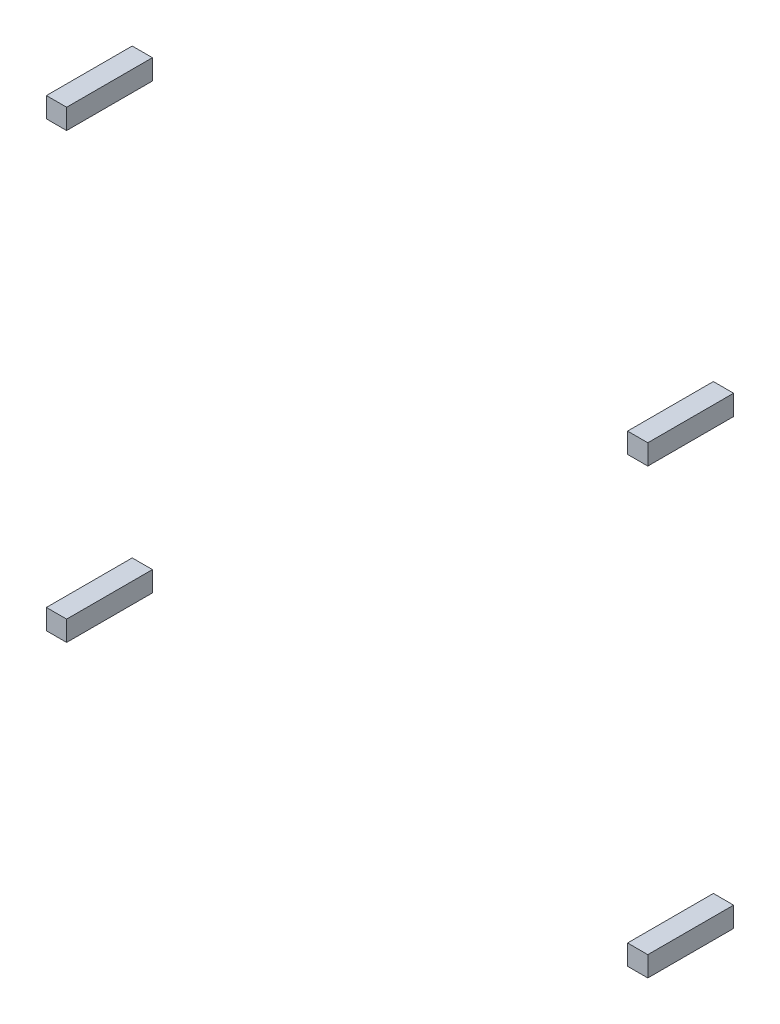
ISO-10303-21;
HEADER;
FILE_DESCRIPTION(('STEP AP214'),'2;1');
FILE_NAME('part.step','',(''),(''),'','','');
FILE_SCHEMA(('AUTOMOTIVE_DESIGN { 1 0 10303 214 1 1 1 1 }'));
ENDSEC;
DATA;
#1=APPLICATION_CONTEXT('core data for automotive mechanical design processes');
#2=APPLICATION_PROTOCOL_DEFINITION('international standard','automotive_design',2000,#1);
#3=PRODUCT_CONTEXT('',#1,'mechanical');
#4=PRODUCT('Part','Part','',(#3));
#5=PRODUCT_RELATED_PRODUCT_CATEGORY('part','',(#4));
#6=PRODUCT_DEFINITION_FORMATION('','',#4);
#7=PRODUCT_DEFINITION_CONTEXT('part definition',#1,'design');
#8=PRODUCT_DEFINITION('design','',#6,#7);
#9=PRODUCT_DEFINITION_SHAPE('','',#8);
#10=(LENGTH_UNIT() NAMED_UNIT(*) SI_UNIT(.MILLI.,.METRE.));
#11=(NAMED_UNIT(*) PLANE_ANGLE_UNIT() SI_UNIT($,.RADIAN.));
#12=(NAMED_UNIT(*) SI_UNIT($,.STERADIAN.) SOLID_ANGLE_UNIT());
#13=UNCERTAINTY_MEASURE_WITH_UNIT(LENGTH_MEASURE(1.E-05),#10,'distance_accuracy_value','');
#14=(GEOMETRIC_REPRESENTATION_CONTEXT(3) GLOBAL_UNCERTAINTY_ASSIGNED_CONTEXT((#13)) GLOBAL_UNIT_ASSIGNED_CONTEXT((#10,
#11,#12)) REPRESENTATION_CONTEXT('',''));
#15=CARTESIAN_POINT('',(0.,0.,0.));
#16=DIRECTION('',(0.,0.,1.));
#17=DIRECTION('',(1.,0.,0.));
#18=AXIS2_PLACEMENT_3D('',#15,#16,#17);
#19=CARTESIAN_POINT('',(20.6735533905932,15.8535533905933,3.));
#20=DIRECTION('',(-1.,0.,0.));
#21=DIRECTION('',(0.,0.,1.));
#22=AXIS2_PLACEMENT_3D('',#19,#20,#21);
#23=PLANE('',#22);
#24=DIRECTION('',(0.,1.,0.));
#25=VECTOR('',#24,1.);
#26=CARTESIAN_POINT('',(20.6735533905932,15.8535533905933,0.));
#27=LINE('',#26,#25);
#28=CARTESIAN_POINT('',(20.6735533905932,15.1464466094067,0.));
#29=VERTEX_POINT('',#28);
#30=CARTESIAN_POINT('',(20.6735533905932,15.8535533905933,0.));
#31=VERTEX_POINT('',#30);
#32=EDGE_CURVE('E108',#29,#31,#27,.T.);
#33=ORIENTED_EDGE('',*,*,#32,.T.);
#34=DIRECTION('',(0.,0.,-1.));
#35=VECTOR('',#34,1.);
#36=CARTESIAN_POINT('',(20.6735533905932,15.8535533905933,3.));
#37=LINE('',#36,#35);
#38=CARTESIAN_POINT('',(20.6735533905932,15.8535533905933,3.));
#39=VERTEX_POINT('',#38);
#40=EDGE_CURVE('E12',#39,#31,#37,.T.);
#41=ORIENTED_EDGE('',*,*,#40,.F.);
#42=DIRECTION('',(0.,1.,0.));
#43=VECTOR('',#42,1.);
#44=CARTESIAN_POINT('',(20.6735533905932,15.8535533905933,3.));
#45=LINE('',#44,#43);
#46=CARTESIAN_POINT('',(20.6735533905932,15.1464466094067,3.));
#47=VERTEX_POINT('',#46);
#48=EDGE_CURVE('E96',#47,#39,#45,.T.);
#49=ORIENTED_EDGE('',*,*,#48,.F.);
#50=DIRECTION('',(0.,0.,-1.));
#51=VECTOR('',#50,1.);
#52=CARTESIAN_POINT('',(20.6735533905932,15.1464466094067,3.));
#53=LINE('',#52,#51);
#54=EDGE_CURVE('E104',#47,#29,#53,.T.);
#55=ORIENTED_EDGE('',*,*,#54,.T.);
#56=EDGE_LOOP('',(#33,#41,#49,#55));
#57=FACE_BOUND('',#56,.T.);
#58=ADVANCED_FACE('F45',(#57),#23,.F.);
#59=CARTESIAN_POINT('',(19.9664466094067,15.8535533905933,3.));
#60=DIRECTION('',(0.,-1.,0.));
#61=DIRECTION('',(0.,0.,-1.));
#62=AXIS2_PLACEMENT_3D('',#59,#60,#61);
#63=PLANE('',#62);
#64=DIRECTION('',(-1.,0.,0.));
#65=VECTOR('',#64,1.);
#66=CARTESIAN_POINT('',(19.9664466094067,15.8535533905933,0.));
#67=LINE('',#66,#65);
#68=CARTESIAN_POINT('',(19.9664466094067,15.8535533905933,0.));
#69=VERTEX_POINT('',#68);
#70=EDGE_CURVE('E100',#31,#69,#67,.T.);
#71=ORIENTED_EDGE('',*,*,#70,.T.);
#72=DIRECTION('',(0.,0.,-1.));
#73=VECTOR('',#72,1.);
#74=CARTESIAN_POINT('',(19.9664466094067,15.8535533905933,3.));
#75=LINE('',#74,#73);
#76=CARTESIAN_POINT('',(19.9664466094067,15.8535533905933,3.));
#77=VERTEX_POINT('',#76);
#78=EDGE_CURVE('E53',#77,#69,#75,.T.);
#79=ORIENTED_EDGE('',*,*,#78,.F.);
#80=DIRECTION('',(-1.,0.,0.));
#81=VECTOR('',#80,1.);
#82=CARTESIAN_POINT('',(19.9664466094067,15.8535533905933,3.));
#83=LINE('',#82,#81);
#84=EDGE_CURVE('E91',#39,#77,#83,.T.);
#85=ORIENTED_EDGE('',*,*,#84,.F.);
#86=ORIENTED_EDGE('',*,*,#40,.T.);
#87=EDGE_LOOP('',(#71,#79,#85,#86));
#88=FACE_BOUND('',#87,.T.);
#89=ADVANCED_FACE('F99',(#88),#63,.F.);
#90=CARTESIAN_POINT('',(19.9664466094067,15.8535533905933,3.));
#91=DIRECTION('',(1.,0.,0.));
#92=DIRECTION('',(0.,0.,-1.));
#93=AXIS2_PLACEMENT_3D('',#90,#91,#92);
#94=PLANE('',#93);
#95=DIRECTION('',(0.,-1.,0.));
#96=VECTOR('',#95,1.);
#97=CARTESIAN_POINT('',(19.9664466094067,15.8535533905933,0.));
#98=LINE('',#97,#96);
#99=CARTESIAN_POINT('',(19.9664466094067,15.1464466094067,0.));
#100=VERTEX_POINT('',#99);
#101=EDGE_CURVE('E78',#69,#100,#98,.T.);
#102=ORIENTED_EDGE('',*,*,#101,.T.);
#103=DIRECTION('',(0.,0.,-1.));
#104=VECTOR('',#103,1.);
#105=CARTESIAN_POINT('',(19.9664466094067,15.1464466094067,3.));
#106=LINE('',#105,#104);
#107=CARTESIAN_POINT('',(19.9664466094067,15.1464466094067,3.));
#108=VERTEX_POINT('',#107);
#109=EDGE_CURVE('E101',#108,#100,#106,.T.);
#110=ORIENTED_EDGE('',*,*,#109,.F.);
#111=DIRECTION('',(0.,-1.,0.));
#112=VECTOR('',#111,1.);
#113=CARTESIAN_POINT('',(19.9664466094067,15.8535533905933,3.));
#114=LINE('',#113,#112);
#115=EDGE_CURVE('E94',#77,#108,#114,.T.);
#116=ORIENTED_EDGE('',*,*,#115,.F.);
#117=ORIENTED_EDGE('',*,*,#78,.T.);
#118=EDGE_LOOP('',(#102,#110,#116,#117));
#119=FACE_BOUND('',#118,.T.);
#120=ADVANCED_FACE('F102',(#119),#94,.F.);
#121=CARTESIAN_POINT('',(19.9664466094067,15.1464466094067,3.));
#122=DIRECTION('',(0.,1.,0.));
#123=DIRECTION('',(0.,0.,1.));
#124=AXIS2_PLACEMENT_3D('',#121,#122,#123);
#125=PLANE('',#124);
#126=DIRECTION('',(1.,0.,0.));
#127=VECTOR('',#126,1.);
#128=CARTESIAN_POINT('',(19.9664466094067,15.1464466094067,0.));
#129=LINE('',#128,#127);
#130=EDGE_CURVE('E84',#100,#29,#129,.T.);
#131=ORIENTED_EDGE('',*,*,#130,.T.);
#132=ORIENTED_EDGE('',*,*,#54,.F.);
#133=DIRECTION('',(1.,0.,0.));
#134=VECTOR('',#133,1.);
#135=CARTESIAN_POINT('',(19.9664466094067,15.1464466094067,3.));
#136=LINE('',#135,#134);
#137=EDGE_CURVE('E61',#108,#47,#136,.T.);
#138=ORIENTED_EDGE('',*,*,#137,.F.);
#139=ORIENTED_EDGE('',*,*,#109,.T.);
#140=EDGE_LOOP('',(#131,#132,#138,#139));
#141=FACE_BOUND('',#140,.T.);
#142=ADVANCED_FACE('F115',(#141),#125,.F.);
#143=CARTESIAN_POINT('',(0.,0.,3.));
#144=DIRECTION('',(0.,0.,1.));
#145=DIRECTION('',(1.,0.,0.));
#146=AXIS2_PLACEMENT_3D('',#143,#144,#145);
#147=PLANE('',#146);
#148=ORIENTED_EDGE('',*,*,#48,.T.);
#149=ORIENTED_EDGE('',*,*,#84,.T.);
#150=ORIENTED_EDGE('',*,*,#115,.T.);
#151=ORIENTED_EDGE('',*,*,#137,.T.);
#152=EDGE_LOOP('',(#148,#149,#150,#151));
#153=FACE_BOUND('',#152,.T.);
#154=ADVANCED_FACE('F92',(#153),#147,.T.);
#155=CARTESIAN_POINT('',(0.,0.,0.));
#156=DIRECTION('',(0.,0.,1.));
#157=DIRECTION('',(1.,0.,0.));
#158=AXIS2_PLACEMENT_3D('',#155,#156,#157);
#159=PLANE('',#158);
#160=ORIENTED_EDGE('',*,*,#32,.F.);
#161=ORIENTED_EDGE('',*,*,#130,.F.);
#162=ORIENTED_EDGE('',*,*,#101,.F.);
#163=ORIENTED_EDGE('',*,*,#70,.F.);
#164=EDGE_LOOP('',(#160,#161,#162,#163));
#165=FACE_BOUND('',#164,.T.);
#166=ADVANCED_FACE('F118',(#165),#159,.F.);
#167=CLOSED_SHELL('',(#58,#89,#120,#142,#154,#166));
#168=MANIFOLD_SOLID_BREP('B2',#167);
#169=CARTESIAN_POINT('',(0.353553390593219,15.8535533905933,3.));
#170=DIRECTION('',(-1.,0.,0.));
#171=DIRECTION('',(0.,-1.,0.));
#172=AXIS2_PLACEMENT_3D('',#169,#170,#171);
#173=PLANE('',#172);
#174=DIRECTION('',(0.,1.,0.));
#175=VECTOR('',#174,1.);
#176=CARTESIAN_POINT('',(0.353553390593219,15.8535533905933,0.));
#177=LINE('',#176,#175);
#178=CARTESIAN_POINT('',(0.353553390593219,15.1464466094067,0.));
#179=VERTEX_POINT('',#178);
#180=CARTESIAN_POINT('',(0.353553390593219,15.8535533905933,0.));
#181=VERTEX_POINT('',#180);
#182=EDGE_CURVE('E241',#179,#181,#177,.T.);
#183=ORIENTED_EDGE('',*,*,#182,.T.);
#184=DIRECTION('',(0.,0.,-1.));
#185=VECTOR('',#184,1.);
#186=CARTESIAN_POINT('',(0.353553390593219,15.8535533905933,3.));
#187=LINE('',#186,#185);
#188=CARTESIAN_POINT('',(0.353553390593219,15.8535533905933,3.));
#189=VERTEX_POINT('',#188);
#190=EDGE_CURVE('E43',#189,#181,#187,.T.);
#191=ORIENTED_EDGE('',*,*,#190,.F.);
#192=DIRECTION('',(0.,1.,0.));
#193=VECTOR('',#192,1.);
#194=CARTESIAN_POINT('',(0.353553390593219,15.8535533905933,3.));
#195=LINE('',#194,#193);
#196=CARTESIAN_POINT('',(0.353553390593219,15.1464466094067,3.));
#197=VERTEX_POINT('',#196);
#198=EDGE_CURVE('E229',#197,#189,#195,.T.);
#199=ORIENTED_EDGE('',*,*,#198,.F.);
#200=DIRECTION('',(0.,0.,-1.));
#201=VECTOR('',#200,1.);
#202=CARTESIAN_POINT('',(0.353553390593219,15.1464466094067,3.));
#203=LINE('',#202,#201);
#204=EDGE_CURVE('E237',#197,#179,#203,.T.);
#205=ORIENTED_EDGE('',*,*,#204,.T.);
#206=EDGE_LOOP('',(#183,#191,#199,#205));
#207=FACE_BOUND('',#206,.T.);
#208=ADVANCED_FACE('F178',(#207),#173,.F.);
#209=CARTESIAN_POINT('',(-0.353553390593328,15.8535533905933,3.));
#210=DIRECTION('',(0.,-1.,0.));
#211=DIRECTION('',(0.,0.,-1.));
#212=AXIS2_PLACEMENT_3D('',#209,#210,#211);
#213=PLANE('',#212);
#214=DIRECTION('',(-1.,0.,0.));
#215=VECTOR('',#214,1.);
#216=CARTESIAN_POINT('',(-0.353553390593328,15.8535533905933,0.));
#217=LINE('',#216,#215);
#218=CARTESIAN_POINT('',(-0.353553390593328,15.8535533905933,0.));
#219=VERTEX_POINT('',#218);
#220=EDGE_CURVE('E233',#181,#219,#217,.T.);
#221=ORIENTED_EDGE('',*,*,#220,.T.);
#222=DIRECTION('',(0.,0.,-1.));
#223=VECTOR('',#222,1.);
#224=CARTESIAN_POINT('',(-0.353553390593328,15.8535533905933,3.));
#225=LINE('',#224,#223);
#226=CARTESIAN_POINT('',(-0.353553390593328,15.8535533905933,3.));
#227=VERTEX_POINT('',#226);
#228=EDGE_CURVE('E186',#227,#219,#225,.T.);
#229=ORIENTED_EDGE('',*,*,#228,.F.);
#230=DIRECTION('',(-1.,0.,0.));
#231=VECTOR('',#230,1.);
#232=CARTESIAN_POINT('',(-0.353553390593328,15.8535533905933,3.));
#233=LINE('',#232,#231);
#234=EDGE_CURVE('E224',#189,#227,#233,.T.);
#235=ORIENTED_EDGE('',*,*,#234,.F.);
#236=ORIENTED_EDGE('',*,*,#190,.T.);
#237=EDGE_LOOP('',(#221,#229,#235,#236));
#238=FACE_BOUND('',#237,.T.);
#239=ADVANCED_FACE('F232',(#238),#213,.F.);
#240=CARTESIAN_POINT('',(-0.353553390593328,15.8535533905933,3.));
#241=DIRECTION('',(1.,0.,0.));
#242=DIRECTION('',(0.,1.,0.));
#243=AXIS2_PLACEMENT_3D('',#240,#241,#242);
#244=PLANE('',#243);
#245=DIRECTION('',(0.,-1.,0.));
#246=VECTOR('',#245,1.);
#247=CARTESIAN_POINT('',(-0.353553390593328,15.8535533905933,0.));
#248=LINE('',#247,#246);
#249=CARTESIAN_POINT('',(-0.353553390593328,15.1464466094067,0.));
#250=VERTEX_POINT('',#249);
#251=EDGE_CURVE('E211',#219,#250,#248,.T.);
#252=ORIENTED_EDGE('',*,*,#251,.T.);
#253=DIRECTION('',(0.,0.,-1.));
#254=VECTOR('',#253,1.);
#255=CARTESIAN_POINT('',(-0.353553390593328,15.1464466094067,3.));
#256=LINE('',#255,#254);
#257=CARTESIAN_POINT('',(-0.353553390593328,15.1464466094067,3.));
#258=VERTEX_POINT('',#257);
#259=EDGE_CURVE('E234',#258,#250,#256,.T.);
#260=ORIENTED_EDGE('',*,*,#259,.F.);
#261=DIRECTION('',(0.,-1.,0.));
#262=VECTOR('',#261,1.);
#263=CARTESIAN_POINT('',(-0.353553390593328,15.8535533905933,3.));
#264=LINE('',#263,#262);
#265=EDGE_CURVE('E227',#227,#258,#264,.T.);
#266=ORIENTED_EDGE('',*,*,#265,.F.);
#267=ORIENTED_EDGE('',*,*,#228,.T.);
#268=EDGE_LOOP('',(#252,#260,#266,#267));
#269=FACE_BOUND('',#268,.T.);
#270=ADVANCED_FACE('F235',(#269),#244,.F.);
#271=CARTESIAN_POINT('',(-0.353553390593328,15.1464466094067,3.));
#272=DIRECTION('',(0.,1.,0.));
#273=DIRECTION('',(0.,0.,1.));
#274=AXIS2_PLACEMENT_3D('',#271,#272,#273);
#275=PLANE('',#274);
#276=DIRECTION('',(1.,0.,0.));
#277=VECTOR('',#276,1.);
#278=CARTESIAN_POINT('',(-0.353553390593328,15.1464466094067,0.));
#279=LINE('',#278,#277);
#280=EDGE_CURVE('E217',#250,#179,#279,.T.);
#281=ORIENTED_EDGE('',*,*,#280,.T.);
#282=ORIENTED_EDGE('',*,*,#204,.F.);
#283=DIRECTION('',(1.,0.,0.));
#284=VECTOR('',#283,1.);
#285=CARTESIAN_POINT('',(-0.353553390593328,15.1464466094067,3.));
#286=LINE('',#285,#284);
#287=EDGE_CURVE('E194',#258,#197,#286,.T.);
#288=ORIENTED_EDGE('',*,*,#287,.F.);
#289=ORIENTED_EDGE('',*,*,#259,.T.);
#290=EDGE_LOOP('',(#281,#282,#288,#289));
#291=FACE_BOUND('',#290,.T.);
#292=ADVANCED_FACE('F248',(#291),#275,.F.);
#293=CARTESIAN_POINT('',(0.,0.,3.));
#294=DIRECTION('',(0.,0.,1.));
#295=DIRECTION('',(1.,0.,0.));
#296=AXIS2_PLACEMENT_3D('',#293,#294,#295);
#297=PLANE('',#296);
#298=ORIENTED_EDGE('',*,*,#198,.T.);
#299=ORIENTED_EDGE('',*,*,#234,.T.);
#300=ORIENTED_EDGE('',*,*,#265,.T.);
#301=ORIENTED_EDGE('',*,*,#287,.T.);
#302=EDGE_LOOP('',(#298,#299,#300,#301));
#303=FACE_BOUND('',#302,.T.);
#304=ADVANCED_FACE('F225',(#303),#297,.T.);
#305=CARTESIAN_POINT('',(0.,0.,0.));
#306=DIRECTION('',(0.,0.,1.));
#307=DIRECTION('',(1.,0.,0.));
#308=AXIS2_PLACEMENT_3D('',#305,#306,#307);
#309=PLANE('',#308);
#310=ORIENTED_EDGE('',*,*,#182,.F.);
#311=ORIENTED_EDGE('',*,*,#280,.F.);
#312=ORIENTED_EDGE('',*,*,#251,.F.);
#313=ORIENTED_EDGE('',*,*,#220,.F.);
#314=EDGE_LOOP('',(#310,#311,#312,#313));
#315=FACE_BOUND('',#314,.T.);
#316=ADVANCED_FACE('F251',(#315),#309,.F.);
#317=CLOSED_SHELL('',(#208,#239,#270,#292,#304,#316));
#318=MANIFOLD_SOLID_BREP('B6',#317);
#319=CARTESIAN_POINT('',(20.6735533905933,0.353553390593275,3.));
#320=DIRECTION('',(-1.,0.,0.));
#321=DIRECTION('',(0.,0.,1.));
#322=AXIS2_PLACEMENT_3D('',#319,#320,#321);
#323=PLANE('',#322);
#324=DIRECTION('',(0.,1.,0.));
#325=VECTOR('',#324,1.);
#326=CARTESIAN_POINT('',(20.6735533905933,0.353553390593275,0.));
#327=LINE('',#326,#325);
#328=CARTESIAN_POINT('',(20.6735533905933,-0.353553390593275,0.));
#329=VERTEX_POINT('',#328);
#330=CARTESIAN_POINT('',(20.6735533905933,0.353553390593275,0.));
#331=VERTEX_POINT('',#330);
#332=EDGE_CURVE('E373',#329,#331,#327,.T.);
#333=ORIENTED_EDGE('',*,*,#332,.T.);
#334=DIRECTION('',(0.,0.,-1.));
#335=VECTOR('',#334,1.);
#336=CARTESIAN_POINT('',(20.6735533905933,0.353553390593275,3.));
#337=LINE('',#336,#335);
#338=CARTESIAN_POINT('',(20.6735533905933,0.353553390593275,3.));
#339=VERTEX_POINT('',#338);
#340=EDGE_CURVE('E176',#339,#331,#337,.T.);
#341=ORIENTED_EDGE('',*,*,#340,.F.);
#342=DIRECTION('',(0.,1.,0.));
#343=VECTOR('',#342,1.);
#344=CARTESIAN_POINT('',(20.6735533905933,0.353553390593275,3.));
#345=LINE('',#344,#343);
#346=CARTESIAN_POINT('',(20.6735533905933,-0.353553390593275,3.));
#347=VERTEX_POINT('',#346);
#348=EDGE_CURVE('E361',#347,#339,#345,.T.);
#349=ORIENTED_EDGE('',*,*,#348,.F.);
#350=DIRECTION('',(0.,0.,-1.));
#351=VECTOR('',#350,1.);
#352=CARTESIAN_POINT('',(20.6735533905933,-0.353553390593275,3.));
#353=LINE('',#352,#351);
#354=EDGE_CURVE('E369',#347,#329,#353,.T.);
#355=ORIENTED_EDGE('',*,*,#354,.T.);
#356=EDGE_LOOP('',(#333,#341,#349,#355));
#357=FACE_BOUND('',#356,.T.);
#358=ADVANCED_FACE('F310',(#357),#323,.F.);
#359=CARTESIAN_POINT('',(19.9664466094067,0.353553390593275,3.));
#360=DIRECTION('',(0.,-1.,0.));
#361=DIRECTION('',(1.,0.,0.));
#362=AXIS2_PLACEMENT_3D('',#359,#360,#361);
#363=PLANE('',#362);
#364=DIRECTION('',(-1.,0.,0.));
#365=VECTOR('',#364,1.);
#366=CARTESIAN_POINT('',(19.9664466094067,0.353553390593275,0.));
#367=LINE('',#366,#365);
#368=CARTESIAN_POINT('',(19.9664466094067,0.353553390593275,0.));
#369=VERTEX_POINT('',#368);
#370=EDGE_CURVE('E365',#331,#369,#367,.T.);
#371=ORIENTED_EDGE('',*,*,#370,.T.);
#372=DIRECTION('',(0.,0.,-1.));
#373=VECTOR('',#372,1.);
#374=CARTESIAN_POINT('',(19.9664466094067,0.353553390593275,3.));
#375=LINE('',#374,#373);
#376=CARTESIAN_POINT('',(19.9664466094067,0.353553390593275,3.));
#377=VERTEX_POINT('',#376);
#378=EDGE_CURVE('E318',#377,#369,#375,.T.);
#379=ORIENTED_EDGE('',*,*,#378,.F.);
#380=DIRECTION('',(-1.,0.,0.));
#381=VECTOR('',#380,1.);
#382=CARTESIAN_POINT('',(19.9664466094067,0.353553390593275,3.));
#383=LINE('',#382,#381);
#384=EDGE_CURVE('E356',#339,#377,#383,.T.);
#385=ORIENTED_EDGE('',*,*,#384,.F.);
#386=ORIENTED_EDGE('',*,*,#340,.T.);
#387=EDGE_LOOP('',(#371,#379,#385,#386));
#388=FACE_BOUND('',#387,.T.);
#389=ADVANCED_FACE('F364',(#388),#363,.F.);
#390=CARTESIAN_POINT('',(19.9664466094067,0.353553390593275,3.));
#391=DIRECTION('',(1.,0.,0.));
#392=DIRECTION('',(0.,0.,-1.));
#393=AXIS2_PLACEMENT_3D('',#390,#391,#392);
#394=PLANE('',#393);
#395=DIRECTION('',(0.,-1.,0.));
#396=VECTOR('',#395,1.);
#397=CARTESIAN_POINT('',(19.9664466094067,0.353553390593275,0.));
#398=LINE('',#397,#396);
#399=CARTESIAN_POINT('',(19.9664466094067,-0.353553390593275,0.));
#400=VERTEX_POINT('',#399);
#401=EDGE_CURVE('E343',#369,#400,#398,.T.);
#402=ORIENTED_EDGE('',*,*,#401,.T.);
#403=DIRECTION('',(0.,0.,-1.));
#404=VECTOR('',#403,1.);
#405=CARTESIAN_POINT('',(19.9664466094067,-0.353553390593275,3.));
#406=LINE('',#405,#404);
#407=CARTESIAN_POINT('',(19.9664466094067,-0.353553390593275,3.));
#408=VERTEX_POINT('',#407);
#409=EDGE_CURVE('E366',#408,#400,#406,.T.);
#410=ORIENTED_EDGE('',*,*,#409,.F.);
#411=DIRECTION('',(0.,-1.,0.));
#412=VECTOR('',#411,1.);
#413=CARTESIAN_POINT('',(19.9664466094067,0.353553390593275,3.));
#414=LINE('',#413,#412);
#415=EDGE_CURVE('E359',#377,#408,#414,.T.);
#416=ORIENTED_EDGE('',*,*,#415,.F.);
#417=ORIENTED_EDGE('',*,*,#378,.T.);
#418=EDGE_LOOP('',(#402,#410,#416,#417));
#419=FACE_BOUND('',#418,.T.);
#420=ADVANCED_FACE('F367',(#419),#394,.F.);
#421=CARTESIAN_POINT('',(19.9664466094067,-0.353553390593275,3.));
#422=DIRECTION('',(0.,1.,0.));
#423=DIRECTION('',(0.,0.,1.));
#424=AXIS2_PLACEMENT_3D('',#421,#422,#423);
#425=PLANE('',#424);
#426=DIRECTION('',(1.,0.,0.));
#427=VECTOR('',#426,1.);
#428=CARTESIAN_POINT('',(19.9664466094067,-0.353553390593275,0.));
#429=LINE('',#428,#427);
#430=EDGE_CURVE('E349',#400,#329,#429,.T.);
#431=ORIENTED_EDGE('',*,*,#430,.T.);
#432=ORIENTED_EDGE('',*,*,#354,.F.);
#433=DIRECTION('',(1.,0.,0.));
#434=VECTOR('',#433,1.);
#435=CARTESIAN_POINT('',(19.9664466094067,-0.353553390593275,3.));
#436=LINE('',#435,#434);
#437=EDGE_CURVE('E326',#408,#347,#436,.T.);
#438=ORIENTED_EDGE('',*,*,#437,.F.);
#439=ORIENTED_EDGE('',*,*,#409,.T.);
#440=EDGE_LOOP('',(#431,#432,#438,#439));
#441=FACE_BOUND('',#440,.T.);
#442=ADVANCED_FACE('F380',(#441),#425,.F.);
#443=CARTESIAN_POINT('',(0.,0.,3.));
#444=DIRECTION('',(0.,0.,1.));
#445=DIRECTION('',(1.,0.,0.));
#446=AXIS2_PLACEMENT_3D('',#443,#444,#445);
#447=PLANE('',#446);
#448=ORIENTED_EDGE('',*,*,#348,.T.);
#449=ORIENTED_EDGE('',*,*,#384,.T.);
#450=ORIENTED_EDGE('',*,*,#415,.T.);
#451=ORIENTED_EDGE('',*,*,#437,.T.);
#452=EDGE_LOOP('',(#448,#449,#450,#451));
#453=FACE_BOUND('',#452,.T.);
#454=ADVANCED_FACE('F357',(#453),#447,.T.);
#455=CARTESIAN_POINT('',(0.,0.,0.));
#456=DIRECTION('',(0.,0.,1.));
#457=DIRECTION('',(1.,0.,0.));
#458=AXIS2_PLACEMENT_3D('',#455,#456,#457);
#459=PLANE('',#458);
#460=ORIENTED_EDGE('',*,*,#332,.F.);
#461=ORIENTED_EDGE('',*,*,#430,.F.);
#462=ORIENTED_EDGE('',*,*,#401,.F.);
#463=ORIENTED_EDGE('',*,*,#370,.F.);
#464=EDGE_LOOP('',(#460,#461,#462,#463));
#465=FACE_BOUND('',#464,.T.);
#466=ADVANCED_FACE('F383',(#465),#459,.F.);
#467=CLOSED_SHELL('',(#358,#389,#420,#442,#454,#466));
#468=MANIFOLD_SOLID_BREP('B37',#467);
#469=CARTESIAN_POINT('',(0.353553390593273,0.353553390593275,3.));
#470=DIRECTION('',(-1.,0.,0.));
#471=DIRECTION('',(0.,-1.,0.));
#472=AXIS2_PLACEMENT_3D('',#469,#470,#471);
#473=PLANE('',#472);
#474=DIRECTION('',(0.,1.,0.));
#475=VECTOR('',#474,1.);
#476=CARTESIAN_POINT('',(0.353553390593273,0.353553390593275,0.));
#477=LINE('',#476,#475);
#478=CARTESIAN_POINT('',(0.353553390593273,-0.353553390593275,0.));
#479=VERTEX_POINT('',#478);
#480=CARTESIAN_POINT('',(0.353553390593273,0.353553390593275,0.));
#481=VERTEX_POINT('',#480);
#482=EDGE_CURVE('E496',#479,#481,#477,.T.);
#483=ORIENTED_EDGE('',*,*,#482,.T.);
#484=DIRECTION('',(0.,0.,-1.));
#485=VECTOR('',#484,1.);
#486=CARTESIAN_POINT('',(0.353553390593273,0.353553390593275,3.));
#487=LINE('',#486,#485);
#488=CARTESIAN_POINT('',(0.353553390593273,0.353553390593275,3.));
#489=VERTEX_POINT('',#488);
#490=EDGE_CURVE('E308',#489,#481,#487,.T.);
#491=ORIENTED_EDGE('',*,*,#490,.F.);
#492=DIRECTION('',(0.,1.,0.));
#493=VECTOR('',#492,1.);
#494=CARTESIAN_POINT('',(0.353553390593273,0.353553390593275,3.));
#495=LINE('',#494,#493);
#496=CARTESIAN_POINT('',(0.353553390593273,-0.353553390593275,3.));
#497=VERTEX_POINT('',#496);
#498=EDGE_CURVE('E484',#497,#489,#495,.T.);
#499=ORIENTED_EDGE('',*,*,#498,.F.);
#500=DIRECTION('',(0.,0.,-1.));
#501=VECTOR('',#500,1.);
#502=CARTESIAN_POINT('',(0.353553390593273,-0.353553390593275,3.));
#503=LINE('',#502,#501);
#504=EDGE_CURVE('E492',#497,#479,#503,.T.);
#505=ORIENTED_EDGE('',*,*,#504,.T.);
#506=EDGE_LOOP('',(#483,#491,#499,#505));
#507=FACE_BOUND('',#506,.T.);
#508=ADVANCED_FACE('F433',(#507),#473,.F.);
#509=CARTESIAN_POINT('',(-0.353553390593274,0.353553390593275,3.));
#510=DIRECTION('',(0.,-1.,0.));
#511=DIRECTION('',(1.,0.,0.));
#512=AXIS2_PLACEMENT_3D('',#509,#510,#511);
#513=PLANE('',#512);
#514=DIRECTION('',(-1.,0.,0.));
#515=VECTOR('',#514,1.);
#516=CARTESIAN_POINT('',(-0.353553390593274,0.353553390593275,0.));
#517=LINE('',#516,#515);
#518=CARTESIAN_POINT('',(-0.353553390593274,0.353553390593275,0.));
#519=VERTEX_POINT('',#518);
#520=EDGE_CURVE('E488',#481,#519,#517,.T.);
#521=ORIENTED_EDGE('',*,*,#520,.T.);
#522=DIRECTION('',(0.,0.,-1.));
#523=VECTOR('',#522,1.);
#524=CARTESIAN_POINT('',(-0.353553390593274,0.353553390593275,3.));
#525=LINE('',#524,#523);
#526=CARTESIAN_POINT('',(-0.353553390593274,0.353553390593275,3.));
#527=VERTEX_POINT('',#526);
#528=EDGE_CURVE('E441',#527,#519,#525,.T.);
#529=ORIENTED_EDGE('',*,*,#528,.F.);
#530=DIRECTION('',(-1.,0.,0.));
#531=VECTOR('',#530,1.);
#532=CARTESIAN_POINT('',(-0.353553390593274,0.353553390593275,3.));
#533=LINE('',#532,#531);
#534=EDGE_CURVE('E479',#489,#527,#533,.T.);
#535=ORIENTED_EDGE('',*,*,#534,.F.);
#536=ORIENTED_EDGE('',*,*,#490,.T.);
#537=EDGE_LOOP('',(#521,#529,#535,#536));
#538=FACE_BOUND('',#537,.T.);
#539=ADVANCED_FACE('F487',(#538),#513,.F.);
#540=CARTESIAN_POINT('',(-0.353553390593274,0.353553390593275,3.));
#541=DIRECTION('',(1.,0.,0.));
#542=DIRECTION('',(0.,1.,0.));
#543=AXIS2_PLACEMENT_3D('',#540,#541,#542);
#544=PLANE('',#543);
#545=DIRECTION('',(0.,-1.,0.));
#546=VECTOR('',#545,1.);
#547=CARTESIAN_POINT('',(-0.353553390593274,0.353553390593275,0.));
#548=LINE('',#547,#546);
#549=CARTESIAN_POINT('',(-0.353553390593274,-0.353553390593275,0.));
#550=VERTEX_POINT('',#549);
#551=EDGE_CURVE('E466',#519,#550,#548,.T.);
#552=ORIENTED_EDGE('',*,*,#551,.T.);
#553=DIRECTION('',(0.,0.,-1.));
#554=VECTOR('',#553,1.);
#555=CARTESIAN_POINT('',(-0.353553390593274,-0.353553390593275,3.));
#556=LINE('',#555,#554);
#557=CARTESIAN_POINT('',(-0.353553390593274,-0.353553390593275,3.));
#558=VERTEX_POINT('',#557);
#559=EDGE_CURVE('E489',#558,#550,#556,.T.);
#560=ORIENTED_EDGE('',*,*,#559,.F.);
#561=DIRECTION('',(0.,-1.,0.));
#562=VECTOR('',#561,1.);
#563=CARTESIAN_POINT('',(-0.353553390593274,0.353553390593275,3.));
#564=LINE('',#563,#562);
#565=EDGE_CURVE('E482',#527,#558,#564,.T.);
#566=ORIENTED_EDGE('',*,*,#565,.F.);
#567=ORIENTED_EDGE('',*,*,#528,.T.);
#568=EDGE_LOOP('',(#552,#560,#566,#567));
#569=FACE_BOUND('',#568,.T.);
#570=ADVANCED_FACE('F490',(#569),#544,.F.);
#571=CARTESIAN_POINT('',(-0.353553390593274,-0.353553390593275,3.));
#572=DIRECTION('',(0.,1.,0.));
#573=DIRECTION('',(0.,0.,1.));
#574=AXIS2_PLACEMENT_3D('',#571,#572,#573);
#575=PLANE('',#574);
#576=DIRECTION('',(1.,0.,0.));
#577=VECTOR('',#576,1.);
#578=CARTESIAN_POINT('',(-0.353553390593274,-0.353553390593275,0.));
#579=LINE('',#578,#577);
#580=EDGE_CURVE('E472',#550,#479,#579,.T.);
#581=ORIENTED_EDGE('',*,*,#580,.T.);
#582=ORIENTED_EDGE('',*,*,#504,.F.);
#583=DIRECTION('',(1.,0.,0.));
#584=VECTOR('',#583,1.);
#585=CARTESIAN_POINT('',(-0.353553390593274,-0.353553390593275,3.));
#586=LINE('',#585,#584);
#587=EDGE_CURVE('E449',#558,#497,#586,.T.);
#588=ORIENTED_EDGE('',*,*,#587,.F.);
#589=ORIENTED_EDGE('',*,*,#559,.T.);
#590=EDGE_LOOP('',(#581,#582,#588,#589));
#591=FACE_BOUND('',#590,.T.);
#592=ADVANCED_FACE('F503',(#591),#575,.F.);
#593=CARTESIAN_POINT('',(0.,0.,3.));
#594=DIRECTION('',(0.,0.,1.));
#595=DIRECTION('',(1.,0.,0.));
#596=AXIS2_PLACEMENT_3D('',#593,#594,#595);
#597=PLANE('',#596);
#598=ORIENTED_EDGE('',*,*,#498,.T.);
#599=ORIENTED_EDGE('',*,*,#534,.T.);
#600=ORIENTED_EDGE('',*,*,#565,.T.);
#601=ORIENTED_EDGE('',*,*,#587,.T.);
#602=EDGE_LOOP('',(#598,#599,#600,#601));
#603=FACE_BOUND('',#602,.T.);
#604=ADVANCED_FACE('F480',(#603),#597,.T.);
#605=CARTESIAN_POINT('',(0.,0.,0.));
#606=DIRECTION('',(0.,0.,1.));
#607=DIRECTION('',(1.,0.,0.));
#608=AXIS2_PLACEMENT_3D('',#605,#606,#607);
#609=PLANE('',#608);
#610=ORIENTED_EDGE('',*,*,#482,.F.);
#611=ORIENTED_EDGE('',*,*,#580,.F.);
#612=ORIENTED_EDGE('',*,*,#551,.F.);
#613=ORIENTED_EDGE('',*,*,#520,.F.);
#614=EDGE_LOOP('',(#610,#611,#612,#613));
#615=FACE_BOUND('',#614,.T.);
#616=ADVANCED_FACE('F506',(#615),#609,.F.);
#617=CLOSED_SHELL('',(#508,#539,#570,#592,#604,#616));
#618=MANIFOLD_SOLID_BREP('B170',#617);
#619=ADVANCED_BREP_SHAPE_REPRESENTATION('',(#18,#168,#318,#468,#618),#14);
#620=SHAPE_DEFINITION_REPRESENTATION(#9,#619);
ENDSEC;
END-ISO-10303-21;
